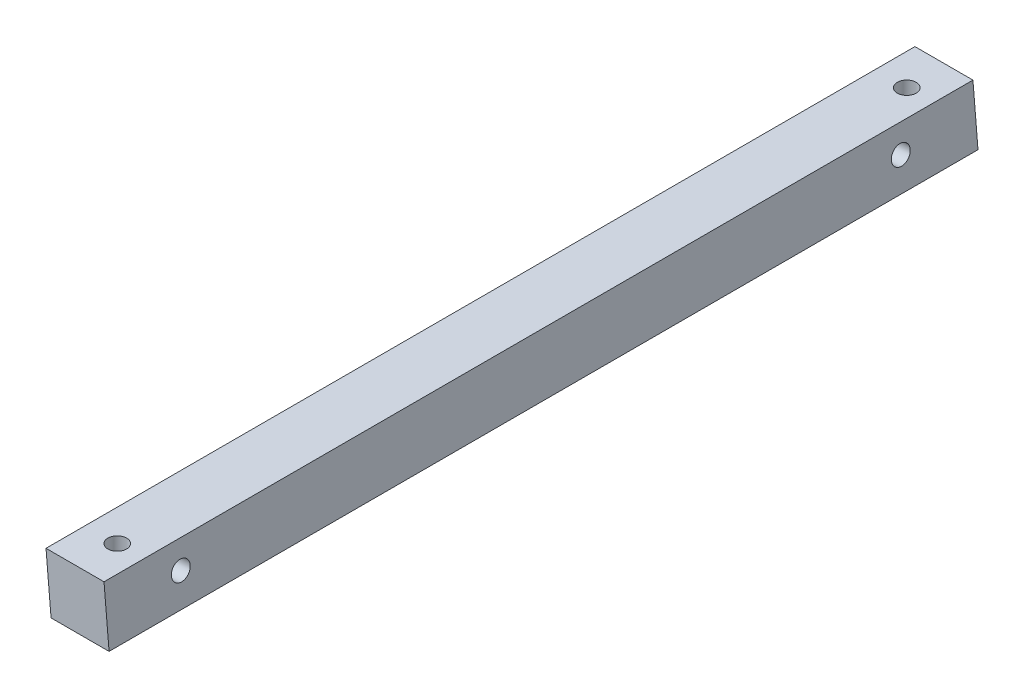
ISO-10303-21;
HEADER;
FILE_DESCRIPTION(('STEP AP214'),'2;1');
FILE_NAME('part.step','',(''),(''),'','','');
FILE_SCHEMA(('AUTOMOTIVE_DESIGN { 1 0 10303 214 1 1 1 1 }'));
ENDSEC;
DATA;
#1=APPLICATION_CONTEXT('core data for automotive mechanical design processes');
#2=APPLICATION_PROTOCOL_DEFINITION('international standard','automotive_design',2000,#1);
#3=PRODUCT_CONTEXT('',#1,'mechanical');
#4=PRODUCT('Part','Part','',(#3));
#5=PRODUCT_RELATED_PRODUCT_CATEGORY('part','',(#4));
#6=PRODUCT_DEFINITION_FORMATION('','',#4);
#7=PRODUCT_DEFINITION_CONTEXT('part definition',#1,'design');
#8=PRODUCT_DEFINITION('design','',#6,#7);
#9=PRODUCT_DEFINITION_SHAPE('','',#8);
#10=(LENGTH_UNIT() NAMED_UNIT(*) SI_UNIT(.MILLI.,.METRE.));
#11=(NAMED_UNIT(*) PLANE_ANGLE_UNIT() SI_UNIT($,.RADIAN.));
#12=(NAMED_UNIT(*) SI_UNIT($,.STERADIAN.) SOLID_ANGLE_UNIT());
#13=UNCERTAINTY_MEASURE_WITH_UNIT(LENGTH_MEASURE(1.E-05),#10,'distance_accuracy_value','');
#14=(GEOMETRIC_REPRESENTATION_CONTEXT(3) GLOBAL_UNCERTAINTY_ASSIGNED_CONTEXT((#13)) GLOBAL_UNIT_ASSIGNED_CONTEXT((#10,
#11,#12)) REPRESENTATION_CONTEXT('',''));
#15=CARTESIAN_POINT('',(0.,0.,0.));
#16=DIRECTION('',(0.,0.,1.));
#17=DIRECTION('',(1.,0.,0.));
#18=AXIS2_PLACEMENT_3D('',#15,#16,#17);
#19=CARTESIAN_POINT('',(-1.01814108997649,11.6374059100212,175.));
#20=DIRECTION('',(0.996194698091745,0.0871557427476619,0.));
#21=DIRECTION('',(-0.0871557427476619,0.996194698091745,0.));
#22=AXIS2_PLACEMENT_3D('',#19,#20,#21);
#23=PLANE('',#22);
#24=CARTESIAN_POINT('',(-0.464702123528838,5.31156957713865,160.));
#25=DIRECTION('',(0.996194698091745,0.0871557427476619,0.));
#26=DIRECTION('',(-0.0871557427476619,0.996194698091745,0.));
#27=AXIS2_PLACEMENT_3D('',#24,#25,#26);
#28=CIRCLE('',#27,1.9);
#29=CARTESIAN_POINT('',(-0.630298034749396,7.20433950351297,160.));
#30=VERTEX_POINT('',#29);
#31=EDGE_CURVE('E117',#30,#30,#28,.T.);
#32=ORIENTED_EDGE('',*,*,#31,.T.);
#33=EDGE_LOOP('',(#32));
#34=FACE_BOUND('',#33,.T.);
#35=CARTESIAN_POINT('',(-0.464702123528838,5.31156957713865,15.));
#36=DIRECTION('',(0.996194698091745,0.0871557427476619,0.));
#37=DIRECTION('',(-0.0871557427476619,0.996194698091745,0.));
#38=AXIS2_PLACEMENT_3D('',#35,#36,#37);
#39=CIRCLE('',#38,1.9);
#40=CARTESIAN_POINT('',(-0.630298034749396,7.20433950351297,15.));
#41=VERTEX_POINT('',#40);
#42=EDGE_CURVE('E109',#41,#41,#39,.T.);
#43=ORIENTED_EDGE('',*,*,#42,.T.);
#44=EDGE_LOOP('',(#43));
#45=FACE_BOUND('',#44,.T.);
#46=DIRECTION('',(0.0871557427476619,-0.996194698091745,0.));
#47=VECTOR('',#46,1.);
#48=CARTESIAN_POINT('',(-1.01814108997649,11.6374059100212,0.));
#49=LINE('',#48,#47);
#50=CARTESIAN_POINT('',(-1.01814108997649,11.6374059100212,0.));
#51=VERTEX_POINT('',#50);
#52=CARTESIAN_POINT('',(0.,0.,0.));
#53=VERTEX_POINT('',#52);
#54=EDGE_CURVE('E99',#51,#53,#49,.T.);
#55=ORIENTED_EDGE('',*,*,#54,.T.);
#56=DIRECTION('',(0.,0.,-1.));
#57=VECTOR('',#56,1.);
#58=CARTESIAN_POINT('',(0.,0.,175.));
#59=LINE('',#58,#57);
#60=CARTESIAN_POINT('',(0.,0.,175.));
#61=VERTEX_POINT('',#60);
#62=EDGE_CURVE('E11',#61,#53,#59,.T.);
#63=ORIENTED_EDGE('',*,*,#62,.F.);
#64=DIRECTION('',(0.0871557427476619,-0.996194698091745,0.));
#65=VECTOR('',#64,1.);
#66=CARTESIAN_POINT('',(-1.01814108997649,11.6374059100212,175.));
#67=LINE('',#66,#65);
#68=CARTESIAN_POINT('',(-1.01814108997649,11.6374059100212,175.));
#69=VERTEX_POINT('',#68);
#70=EDGE_CURVE('E86',#69,#61,#67,.T.);
#71=ORIENTED_EDGE('',*,*,#70,.F.);
#72=DIRECTION('',(0.,0.,-1.));
#73=VECTOR('',#72,1.);
#74=CARTESIAN_POINT('',(-1.01814108997649,11.6374059100212,175.));
#75=LINE('',#74,#73);
#76=EDGE_CURVE('E95',#69,#51,#75,.T.);
#77=ORIENTED_EDGE('',*,*,#76,.T.);
#78=EDGE_LOOP('',(#55,#63,#71,#77));
#79=FACE_BOUND('',#78,.T.);
#80=ADVANCED_FACE('F33',(#34,#45,#79),#23,.F.);
#81=CARTESIAN_POINT('',(0.,0.,175.));
#82=DIRECTION('',(0.,1.,0.));
#83=DIRECTION('',(0.,0.,1.));
#84=AXIS2_PLACEMENT_3D('',#81,#82,#83);
#85=PLANE('',#84);
#86=CARTESIAN_POINT('',(5.33185891002351,0.,8.));
#87=DIRECTION('',(0.,1.,0.));
#88=DIRECTION('',(0.,0.,1.));
#89=AXIS2_PLACEMENT_3D('',#86,#87,#88);
#90=CIRCLE('',#89,1.9);
#91=CARTESIAN_POINT('',(5.33185891002351,0.,9.9));
#92=VERTEX_POINT('',#91);
#93=EDGE_CURVE('E124',#92,#92,#90,.T.);
#94=ORIENTED_EDGE('',*,*,#93,.T.);
#95=EDGE_LOOP('',(#94));
#96=FACE_BOUND('',#95,.T.);
#97=CARTESIAN_POINT('',(5.33185891002353,0.,167.));
#98=DIRECTION('',(0.,1.,0.));
#99=DIRECTION('',(0.,0.,1.));
#100=AXIS2_PLACEMENT_3D('',#97,#98,#99);
#101=CIRCLE('',#100,1.90000000000001);
#102=CARTESIAN_POINT('',(5.33185891002353,0.,168.9));
#103=VERTEX_POINT('',#102);
#104=EDGE_CURVE('E121',#103,#103,#101,.T.);
#105=ORIENTED_EDGE('',*,*,#104,.T.);
#106=EDGE_LOOP('',(#105));
#107=FACE_BOUND('',#106,.T.);
#108=DIRECTION('',(1.,0.,0.));
#109=VECTOR('',#108,1.);
#110=CARTESIAN_POINT('',(0.,0.,0.));
#111=LINE('',#110,#109);
#112=CARTESIAN_POINT('',(11.6818589100235,0.,0.));
#113=VERTEX_POINT('',#112);
#114=EDGE_CURVE('E90',#53,#113,#111,.T.);
#115=ORIENTED_EDGE('',*,*,#114,.T.);
#116=DIRECTION('',(0.,0.,-1.));
#117=VECTOR('',#116,1.);
#118=CARTESIAN_POINT('',(11.6818589100235,0.,175.));
#119=LINE('',#118,#117);
#120=CARTESIAN_POINT('',(11.6818589100235,0.,175.));
#121=VERTEX_POINT('',#120);
#122=EDGE_CURVE('E42',#121,#113,#119,.T.);
#123=ORIENTED_EDGE('',*,*,#122,.F.);
#124=DIRECTION('',(1.,0.,0.));
#125=VECTOR('',#124,1.);
#126=CARTESIAN_POINT('',(0.,0.,175.));
#127=LINE('',#126,#125);
#128=EDGE_CURVE('E81',#61,#121,#127,.T.);
#129=ORIENTED_EDGE('',*,*,#128,.F.);
#130=ORIENTED_EDGE('',*,*,#62,.T.);
#131=EDGE_LOOP('',(#115,#123,#129,#130));
#132=FACE_BOUND('',#131,.T.);
#133=ADVANCED_FACE('F89',(#96,#107,#132),#85,.F.);
#134=CARTESIAN_POINT('',(11.6818589100235,0.,175.));
#135=DIRECTION('',(-0.996194698091745,-0.0871557427476618,0.));
#136=DIRECTION('',(0.0871557427476618,-0.996194698091745,0.));
#137=AXIS2_PLACEMENT_3D('',#134,#135,#136);
#138=PLANE('',#137);
#139=CARTESIAN_POINT('',(11.1284199435759,6.32583633288258,160.));
#140=DIRECTION('',(-0.996194698091745,-0.0871557427476618,0.));
#141=DIRECTION('',(0.0871557427476618,-0.996194698091745,0.));
#142=AXIS2_PLACEMENT_3D('',#139,#140,#141);
#143=CIRCLE('',#142,1.9);
#144=CARTESIAN_POINT('',(10.9628240323553,8.2186062592569,160.));
#145=VERTEX_POINT('',#144);
#146=EDGE_CURVE('E36',#145,#145,#143,.T.);
#147=ORIENTED_EDGE('',*,*,#146,.T.);
#148=EDGE_LOOP('',(#147));
#149=FACE_BOUND('',#148,.T.);
#150=CARTESIAN_POINT('',(11.1284199435759,6.32583633288258,15.));
#151=DIRECTION('',(-0.996194698091745,-0.0871557427476618,0.));
#152=DIRECTION('',(0.0871557427476618,-0.996194698091745,0.));
#153=AXIS2_PLACEMENT_3D('',#150,#151,#152);
#154=CIRCLE('',#153,1.9);
#155=CARTESIAN_POINT('',(10.9628240323553,8.2186062592569,15.));
#156=VERTEX_POINT('',#155);
#157=EDGE_CURVE('E107',#156,#156,#154,.T.);
#158=ORIENTED_EDGE('',*,*,#157,.T.);
#159=EDGE_LOOP('',(#158));
#160=FACE_BOUND('',#159,.T.);
#161=DIRECTION('',(-0.0871557427476618,0.996194698091745,0.));
#162=VECTOR('',#161,1.);
#163=CARTESIAN_POINT('',(11.6818589100235,0.,0.));
#164=LINE('',#163,#162);
#165=CARTESIAN_POINT('',(10.663717820047,11.6374059100212,0.));
#166=VERTEX_POINT('',#165);
#167=EDGE_CURVE('E68',#113,#166,#164,.T.);
#168=ORIENTED_EDGE('',*,*,#167,.T.);
#169=DIRECTION('',(0.,0.,-1.));
#170=VECTOR('',#169,1.);
#171=CARTESIAN_POINT('',(10.663717820047,11.6374059100212,175.));
#172=LINE('',#171,#170);
#173=CARTESIAN_POINT('',(10.663717820047,11.6374059100212,175.));
#174=VERTEX_POINT('',#173);
#175=EDGE_CURVE('E91',#174,#166,#172,.T.);
#176=ORIENTED_EDGE('',*,*,#175,.F.);
#177=DIRECTION('',(-0.0871557427476618,0.996194698091745,0.));
#178=VECTOR('',#177,1.);
#179=CARTESIAN_POINT('',(11.6818589100235,0.,175.));
#180=LINE('',#179,#178);
#181=EDGE_CURVE('E84',#121,#174,#180,.T.);
#182=ORIENTED_EDGE('',*,*,#181,.F.);
#183=ORIENTED_EDGE('',*,*,#122,.T.);
#184=EDGE_LOOP('',(#168,#176,#182,#183));
#185=FACE_BOUND('',#184,.T.);
#186=ADVANCED_FACE('F93',(#149,#160,#185),#138,.F.);
#187=CARTESIAN_POINT('',(10.663717820047,11.6374059100212,175.));
#188=DIRECTION('',(0.,-1.,0.));
#189=DIRECTION('',(1.,0.,0.));
#190=AXIS2_PLACEMENT_3D('',#187,#188,#189);
#191=PLANE('',#190);
#192=CARTESIAN_POINT('',(5.33185891002351,11.6374059100212,8.));
#193=DIRECTION('',(0.,1.,0.));
#194=DIRECTION('',(0.,0.,1.));
#195=AXIS2_PLACEMENT_3D('',#192,#193,#194);
#196=CIRCLE('',#195,1.9);
#197=CARTESIAN_POINT('',(5.33185891002351,11.6374059100212,9.9));
#198=VERTEX_POINT('',#197);
#199=EDGE_CURVE('E102',#198,#198,#196,.T.);
#200=ORIENTED_EDGE('',*,*,#199,.F.);
#201=EDGE_LOOP('',(#200));
#202=FACE_BOUND('',#201,.T.);
#203=CARTESIAN_POINT('',(5.33185891002353,11.6374059100212,167.));
#204=DIRECTION('',(0.,1.,0.));
#205=DIRECTION('',(0.,0.,1.));
#206=AXIS2_PLACEMENT_3D('',#203,#204,#205);
#207=CIRCLE('',#206,1.90000000000001);
#208=CARTESIAN_POINT('',(5.33185891002353,11.6374059100212,168.9));
#209=VERTEX_POINT('',#208);
#210=EDGE_CURVE('E127',#209,#209,#207,.T.);
#211=ORIENTED_EDGE('',*,*,#210,.F.);
#212=EDGE_LOOP('',(#211));
#213=FACE_BOUND('',#212,.T.);
#214=DIRECTION('',(-1.,0.,0.));
#215=VECTOR('',#214,1.);
#216=CARTESIAN_POINT('',(10.663717820047,11.6374059100212,0.));
#217=LINE('',#216,#215);
#218=EDGE_CURVE('E74',#166,#51,#217,.T.);
#219=ORIENTED_EDGE('',*,*,#218,.T.);
#220=ORIENTED_EDGE('',*,*,#76,.F.);
#221=DIRECTION('',(-1.,0.,0.));
#222=VECTOR('',#221,1.);
#223=CARTESIAN_POINT('',(10.663717820047,11.6374059100212,175.));
#224=LINE('',#223,#222);
#225=EDGE_CURVE('E51',#174,#69,#224,.T.);
#226=ORIENTED_EDGE('',*,*,#225,.F.);
#227=ORIENTED_EDGE('',*,*,#175,.T.);
#228=EDGE_LOOP('',(#219,#220,#226,#227));
#229=FACE_BOUND('',#228,.T.);
#230=ADVANCED_FACE('F159',(#202,#213,#229),#191,.F.);
#231=CARTESIAN_POINT('',(0.,0.,175.));
#232=DIRECTION('',(0.,0.,1.));
#233=DIRECTION('',(1.,0.,0.));
#234=AXIS2_PLACEMENT_3D('',#231,#232,#233);
#235=PLANE('',#234);
#236=ORIENTED_EDGE('',*,*,#70,.T.);
#237=ORIENTED_EDGE('',*,*,#128,.T.);
#238=ORIENTED_EDGE('',*,*,#181,.T.);
#239=ORIENTED_EDGE('',*,*,#225,.T.);
#240=EDGE_LOOP('',(#236,#237,#238,#239));
#241=FACE_BOUND('',#240,.T.);
#242=ADVANCED_FACE('F82',(#241),#235,.T.);
#243=CARTESIAN_POINT('',(0.,0.,0.));
#244=DIRECTION('',(0.,0.,1.));
#245=DIRECTION('',(1.,0.,0.));
#246=AXIS2_PLACEMENT_3D('',#243,#244,#245);
#247=PLANE('',#246);
#248=ORIENTED_EDGE('',*,*,#54,.F.);
#249=ORIENTED_EDGE('',*,*,#218,.F.);
#250=ORIENTED_EDGE('',*,*,#167,.F.);
#251=ORIENTED_EDGE('',*,*,#114,.F.);
#252=EDGE_LOOP('',(#248,#249,#250,#251));
#253=FACE_BOUND('',#252,.T.);
#254=ADVANCED_FACE('F137',(#253),#247,.F.);
#255=CARTESIAN_POINT('',(5.33185891002353,11.6374059100212,167.));
#256=DIRECTION('',(0.,-1.,0.));
#257=DIRECTION('',(0.,0.,-1.));
#258=AXIS2_PLACEMENT_3D('',#255,#256,#257);
#259=CYLINDRICAL_SURFACE('',#258,1.90000000000001);
#260=ORIENTED_EDGE('',*,*,#210,.T.);
#261=EDGE_LOOP('',(#260));
#262=FACE_BOUND('',#261,.T.);
#263=ORIENTED_EDGE('',*,*,#104,.F.);
#264=EDGE_LOOP('',(#263));
#265=FACE_BOUND('',#264,.T.);
#266=ADVANCED_FACE('F134',(#262,#265),#259,.F.);
#267=CARTESIAN_POINT('',(5.33185891002351,11.6374059100212,8.));
#268=DIRECTION('',(0.,-1.,0.));
#269=DIRECTION('',(0.,0.,-1.));
#270=AXIS2_PLACEMENT_3D('',#267,#268,#269);
#271=CYLINDRICAL_SURFACE('',#270,1.9);
#272=ORIENTED_EDGE('',*,*,#199,.T.);
#273=EDGE_LOOP('',(#272));
#274=FACE_BOUND('',#273,.T.);
#275=ORIENTED_EDGE('',*,*,#93,.F.);
#276=EDGE_LOOP('',(#275));
#277=FACE_BOUND('',#276,.T.);
#278=ADVANCED_FACE('F136',(#274,#277),#271,.F.);
#279=CARTESIAN_POINT('',(-1.47510928805166,5.22317040469753,15.));
#280=DIRECTION('',(0.996194698091745,0.0871557427476618,0.));
#281=DIRECTION('',(-0.0871557427476618,0.996194698091745,0.));
#282=AXIS2_PLACEMENT_3D('',#279,#280,#281);
#283=CYLINDRICAL_SURFACE('',#282,1.9);
#284=CARTESIAN_POINT('',(10.9628240323553,8.2186062592569,15.));
#285=CARTESIAN_POINT('',(10.8420623441563,8.20804098055124,15.));
#286=CARTESIAN_POINT('',(10.7213006559573,8.19747570184557,15.));
#287=CARTESIAN_POINT('',(10.4797772795593,8.17634514443424,15.));
#288=CARTESIAN_POINT('',(10.3590155913603,8.16577986572857,15.));
#289=CARTESIAN_POINT('',(10.1174922149622,8.14464930831724,15.));
#290=CARTESIAN_POINT('',(9.99673052676324,8.13408402961157,15.));
#291=CARTESIAN_POINT('',(9.75520715036523,8.11295347220024,15.));
#292=CARTESIAN_POINT('',(9.63444546216622,8.10238819349458,15.));
#293=CARTESIAN_POINT('',(9.39292208576821,8.08125763608325,15.));
#294=CARTESIAN_POINT('',(9.2721603975692,8.07069235737758,15.));
#295=CARTESIAN_POINT('',(9.03063702117118,8.04956179996625,15.));
#296=CARTESIAN_POINT('',(8.90987533297218,8.03899652126058,15.));
#297=CARTESIAN_POINT('',(8.66835195657416,8.01786596384925,15.));
#298=CARTESIAN_POINT('',(8.54759026837515,8.00730068514359,15.));
#299=CARTESIAN_POINT('',(8.30606689197714,7.98617012773225,15.));
#300=CARTESIAN_POINT('',(8.18530520377813,7.97560484902659,15.));
#301=CARTESIAN_POINT('',(7.94378182738012,7.95447429161525,15.));
#302=CARTESIAN_POINT('',(7.82302013918111,7.94390901290959,15.));
#303=CARTESIAN_POINT('',(7.5814967627831,7.92277845549826,15.));
#304=CARTESIAN_POINT('',(7.46073507458409,7.91221317679259,15.));
#305=CARTESIAN_POINT('',(7.21921169818608,7.89108261938126,15.));
#306=CARTESIAN_POINT('',(7.09845000998707,7.88051734067559,15.));
#307=CARTESIAN_POINT('',(6.85692663358905,7.85938678326426,15.));
#308=CARTESIAN_POINT('',(6.73616494539005,7.84882150455859,15.));
#309=CARTESIAN_POINT('',(6.49464156899203,7.82769094714726,15.));
#310=CARTESIAN_POINT('',(6.37387988079302,7.8171256684416,15.));
#311=CARTESIAN_POINT('',(6.13235650439501,7.79599511103026,15.));
#312=CARTESIAN_POINT('',(6.011594816196,7.7854298323246,15.));
#313=CARTESIAN_POINT('',(5.77007143979799,7.76429927491327,15.));
#314=CARTESIAN_POINT('',(5.64930975159898,7.7537339962076,15.));
#315=CARTESIAN_POINT('',(5.40778637520097,7.73260343879627,15.));
#316=CARTESIAN_POINT('',(5.28702468700196,7.7220381600906,15.));
#317=CARTESIAN_POINT('',(5.04550131060394,7.70090760267927,15.));
#318=CARTESIAN_POINT('',(4.92473962240494,7.69034232397361,15.));
#319=CARTESIAN_POINT('',(4.68321624600692,7.66921176656227,15.));
#320=CARTESIAN_POINT('',(4.56245455780792,7.65864648785661,15.));
#321=CARTESIAN_POINT('',(4.3209311814099,7.63751593044528,15.));
#322=CARTESIAN_POINT('',(4.20016949321089,7.62695065173961,15.));
#323=CARTESIAN_POINT('',(3.95864611681288,7.60582009432828,15.));
#324=CARTESIAN_POINT('',(3.83788442861387,7.59525481562261,15.));
#325=CARTESIAN_POINT('',(3.59636105221586,7.57412425821128,15.));
#326=CARTESIAN_POINT('',(3.47559936401685,7.56355897950561,15.));
#327=CARTESIAN_POINT('',(3.23407598761884,7.54242842209428,15.));
#328=CARTESIAN_POINT('',(3.11331429941983,7.53186314338862,15.));
#329=CARTESIAN_POINT('',(2.87179092302181,7.51073258597728,15.));
#330=CARTESIAN_POINT('',(2.75102923482281,7.50016730727162,15.));
#331=CARTESIAN_POINT('',(2.50950585842479,7.47903674986029,15.));
#332=CARTESIAN_POINT('',(2.38874417022579,7.46847147115462,15.));
#333=CARTESIAN_POINT('',(2.14722079382777,7.44734091374329,15.));
#334=CARTESIAN_POINT('',(2.02645910562876,7.43677563503762,15.));
#335=CARTESIAN_POINT('',(1.78493572923075,7.41564507762629,15.));
#336=CARTESIAN_POINT('',(1.66417404103174,7.40507979892062,15.));
#337=CARTESIAN_POINT('',(1.42265066463373,7.38394924150929,15.));
#338=CARTESIAN_POINT('',(1.30188897643472,7.37338396280363,15.));
#339=CARTESIAN_POINT('',(1.06036560003671,7.35225340539229,15.));
#340=CARTESIAN_POINT('',(0.939603911837698,7.34168812668663,15.));
#341=CARTESIAN_POINT('',(0.698080535439684,7.3205575692753,15.));
#342=CARTESIAN_POINT('',(0.577318847240676,7.30999229056963,15.));
#343=CARTESIAN_POINT('',(0.335795470842662,7.2888617331583,15.));
#344=CARTESIAN_POINT('',(0.215033782643655,7.27829645445263,15.));
#345=CARTESIAN_POINT('',(-0.0264895937543601,7.2571658970413,15.));
#346=CARTESIAN_POINT('',(-0.147251281953368,7.24660061833564,15.));
#347=CARTESIAN_POINT('',(-0.388774658351382,7.2254700609243,15.));
#348=CARTESIAN_POINT('',(-0.509536346550389,7.21490478221864,15.));
#349=CARTESIAN_POINT('',(-0.630298034749396,7.20433950351297,15.));
#350=B_SPLINE_CURVE_WITH_KNOTS('',3,(#284,#285,#286,#287,#288,#289,#290,#291,#292,#293,#294,
#295,#296,#297,#298,#299,#300,#301,#302,#303,#304,#305,#306,#307,#308,#309,#310,#311,#312,#313,
#314,#315,#316,#317,#318,#319,#320,#321,#322,#323,#324,#325,#326,#327,#328,#329,#330,#331,#332,
#333,#334,#335,#336,#337,#338,#339,#340,#341,#342,#343,#344,#345,#346,#347,#348,#349),
.UNSPECIFIED.,.F.,.F.,(4,2,2,2,2,2,2,2,2,2,2,2,2,2,2,2,2,2,2,2,2,2,2,2,2,2,2,2,2,2,2,2,4),(0.,
0.363668934688163,0.727337869376327,1.09100680406449,1.45467573875265,1.81834467344082,
2.18201360812898,2.54568254281715,2.90935147750531,3.27302041219347,3.63668934688163,
4.0003582815698,4.36402721625796,4.72769615094613,5.09136508563429,5.45503402032245,
5.81870295501062,6.18237188969878,6.54604082438695,6.90970975907511,7.27337869376327,
7.63704762845144,8.0007165631396,8.36438549782776,8.72805443251593,9.09172336720409,
9.45539230189225,9.81906123658042,10.1827301712686,10.5463991059567,10.9100680406449,
11.2737369753331,11.6374059100212),.UNSPECIFIED.);
#351=EDGE_CURVE('BSEAM144',#156,#41,#350,.T.);
#352=ORIENTED_EDGE('',*,*,#157,.F.);
#353=ORIENTED_EDGE('',*,*,#42,.F.);
#354=ORIENTED_EDGE('',*,*,#351,.T.);
#355=ORIENTED_EDGE('',*,*,#351,.F.);
#356=EDGE_LOOP('',(#352,#354,#353,#355));
#357=FACE_BOUND('',#356,.T.);
#358=ADVANCED_FACE('F144',(#357),#283,.F.);
#359=CARTESIAN_POINT('',(-1.47510928805166,5.22317040469753,160.));
#360=DIRECTION('',(0.996194698091745,0.0871557427476618,0.));
#361=DIRECTION('',(-0.0871557427476618,0.996194698091745,0.));
#362=AXIS2_PLACEMENT_3D('',#359,#360,#361);
#363=CYLINDRICAL_SURFACE('',#362,1.9);
#364=CARTESIAN_POINT('',(10.9628240323553,8.2186062592569,160.));
#365=CARTESIAN_POINT('',(10.8420623441563,8.20804098055124,160.));
#366=CARTESIAN_POINT('',(10.7213006559573,8.19747570184557,160.));
#367=CARTESIAN_POINT('',(10.4797772795593,8.17634514443424,160.));
#368=CARTESIAN_POINT('',(10.3590155913603,8.16577986572857,160.));
#369=CARTESIAN_POINT('',(10.1174922149622,8.14464930831724,160.));
#370=CARTESIAN_POINT('',(9.99673052676324,8.13408402961158,160.));
#371=CARTESIAN_POINT('',(9.75520715036523,8.11295347220024,160.));
#372=CARTESIAN_POINT('',(9.63444546216622,8.10238819349458,160.));
#373=CARTESIAN_POINT('',(9.39292208576821,8.08125763608325,160.));
#374=CARTESIAN_POINT('',(9.2721603975692,8.07069235737758,160.));
#375=CARTESIAN_POINT('',(9.03063702117118,8.04956179996625,160.));
#376=CARTESIAN_POINT('',(8.90987533297218,8.03899652126058,160.));
#377=CARTESIAN_POINT('',(8.66835195657416,8.01786596384925,160.));
#378=CARTESIAN_POINT('',(8.54759026837515,8.00730068514359,160.));
#379=CARTESIAN_POINT('',(8.30606689197714,7.98617012773225,160.));
#380=CARTESIAN_POINT('',(8.18530520377813,7.97560484902659,160.));
#381=CARTESIAN_POINT('',(7.94378182738012,7.95447429161525,160.));
#382=CARTESIAN_POINT('',(7.82302013918111,7.94390901290959,160.));
#383=CARTESIAN_POINT('',(7.5814967627831,7.92277845549826,160.));
#384=CARTESIAN_POINT('',(7.46073507458409,7.91221317679259,160.));
#385=CARTESIAN_POINT('',(7.21921169818608,7.89108261938126,160.));
#386=CARTESIAN_POINT('',(7.09845000998707,7.88051734067559,160.));
#387=CARTESIAN_POINT('',(6.85692663358905,7.85938678326426,160.));
#388=CARTESIAN_POINT('',(6.73616494539005,7.84882150455859,160.));
#389=CARTESIAN_POINT('',(6.49464156899203,7.82769094714726,160.));
#390=CARTESIAN_POINT('',(6.37387988079302,7.8171256684416,160.));
#391=CARTESIAN_POINT('',(6.13235650439501,7.79599511103027,160.));
#392=CARTESIAN_POINT('',(6.011594816196,7.7854298323246,160.));
#393=CARTESIAN_POINT('',(5.77007143979799,7.76429927491327,160.));
#394=CARTESIAN_POINT('',(5.64930975159898,7.7537339962076,160.));
#395=CARTESIAN_POINT('',(5.40778637520097,7.73260343879627,160.));
#396=CARTESIAN_POINT('',(5.28702468700196,7.7220381600906,160.));
#397=CARTESIAN_POINT('',(5.04550131060394,7.70090760267927,160.));
#398=CARTESIAN_POINT('',(4.92473962240494,7.69034232397361,160.));
#399=CARTESIAN_POINT('',(4.68321624600692,7.66921176656227,160.));
#400=CARTESIAN_POINT('',(4.56245455780792,7.65864648785661,160.));
#401=CARTESIAN_POINT('',(4.3209311814099,7.63751593044528,160.));
#402=CARTESIAN_POINT('',(4.20016949321089,7.62695065173961,160.));
#403=CARTESIAN_POINT('',(3.95864611681288,7.60582009432828,160.));
#404=CARTESIAN_POINT('',(3.83788442861387,7.59525481562261,160.));
#405=CARTESIAN_POINT('',(3.59636105221586,7.57412425821128,160.));
#406=CARTESIAN_POINT('',(3.47559936401685,7.56355897950561,160.));
#407=CARTESIAN_POINT('',(3.23407598761884,7.54242842209428,160.));
#408=CARTESIAN_POINT('',(3.11331429941983,7.53186314338862,160.));
#409=CARTESIAN_POINT('',(2.87179092302181,7.51073258597729,160.));
#410=CARTESIAN_POINT('',(2.75102923482281,7.50016730727162,160.));
#411=CARTESIAN_POINT('',(2.50950585842479,7.47903674986029,160.));
#412=CARTESIAN_POINT('',(2.38874417022579,7.46847147115462,160.));
#413=CARTESIAN_POINT('',(2.14722079382777,7.44734091374329,160.));
#414=CARTESIAN_POINT('',(2.02645910562876,7.43677563503762,160.));
#415=CARTESIAN_POINT('',(1.78493572923075,7.41564507762629,160.));
#416=CARTESIAN_POINT('',(1.66417404103174,7.40507979892063,160.));
#417=CARTESIAN_POINT('',(1.42265066463373,7.38394924150929,160.));
#418=CARTESIAN_POINT('',(1.30188897643472,7.37338396280363,160.));
#419=CARTESIAN_POINT('',(1.06036560003671,7.3522534053923,160.));
#420=CARTESIAN_POINT('',(0.939603911837698,7.34168812668663,160.));
#421=CARTESIAN_POINT('',(0.698080535439684,7.3205575692753,160.));
#422=CARTESIAN_POINT('',(0.577318847240676,7.30999229056963,160.));
#423=CARTESIAN_POINT('',(0.335795470842662,7.2888617331583,160.));
#424=CARTESIAN_POINT('',(0.215033782643655,7.27829645445263,160.));
#425=CARTESIAN_POINT('',(-0.0264895937543601,7.2571658970413,160.));
#426=CARTESIAN_POINT('',(-0.147251281953368,7.24660061833564,160.));
#427=CARTESIAN_POINT('',(-0.388774658351382,7.22547006092431,160.));
#428=CARTESIAN_POINT('',(-0.509536346550389,7.21490478221864,160.));
#429=CARTESIAN_POINT('',(-0.630298034749396,7.20433950351297,160.));
#430=B_SPLINE_CURVE_WITH_KNOTS('',3,(#364,#365,#366,#367,#368,#369,#370,#371,#372,#373,#374,
#375,#376,#377,#378,#379,#380,#381,#382,#383,#384,#385,#386,#387,#388,#389,#390,#391,#392,#393,
#394,#395,#396,#397,#398,#399,#400,#401,#402,#403,#404,#405,#406,#407,#408,#409,#410,#411,#412,
#413,#414,#415,#416,#417,#418,#419,#420,#421,#422,#423,#424,#425,#426,#427,#428,#429),
.UNSPECIFIED.,.F.,.F.,(4,2,2,2,2,2,2,2,2,2,2,2,2,2,2,2,2,2,2,2,2,2,2,2,2,2,2,2,2,2,2,2,4),(0.,
0.363668934688163,0.727337869376327,1.09100680406449,1.45467573875265,1.81834467344082,
2.18201360812898,2.54568254281715,2.90935147750531,3.27302041219347,3.63668934688163,
4.0003582815698,4.36402721625796,4.72769615094613,5.09136508563429,5.45503402032245,
5.81870295501062,6.18237188969878,6.54604082438695,6.90970975907511,7.27337869376327,
7.63704762845144,8.0007165631396,8.36438549782777,8.72805443251593,9.09172336720409,
9.45539230189226,9.81906123658042,10.1827301712686,10.5463991059567,10.9100680406449,
11.2737369753331,11.6374059100212),.UNSPECIFIED.);
#431=EDGE_CURVE('BSEAM178',#145,#30,#430,.T.);
#432=ORIENTED_EDGE('',*,*,#146,.F.);
#433=ORIENTED_EDGE('',*,*,#31,.F.);
#434=ORIENTED_EDGE('',*,*,#431,.T.);
#435=ORIENTED_EDGE('',*,*,#431,.F.);
#436=EDGE_LOOP('',(#432,#434,#433,#435));
#437=FACE_BOUND('',#436,.T.);
#438=ADVANCED_FACE('F178',(#437),#363,.F.);
#439=CLOSED_SHELL('',(#80,#133,#186,#230,#242,#254,#266,#278,#358,#438));
#440=MANIFOLD_SOLID_BREP('B2',#439);
#441=ADVANCED_BREP_SHAPE_REPRESENTATION('',(#18,#440),#14);
#442=SHAPE_DEFINITION_REPRESENTATION(#9,#441);
ENDSEC;
END-ISO-10303-21;
